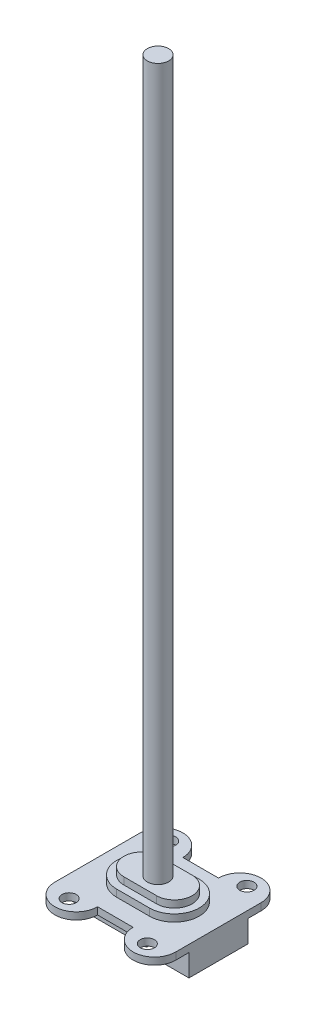
ISO-10303-21;
HEADER;
FILE_DESCRIPTION(('STEP AP214'),'2;1');
FILE_NAME('part.step','',(''),(''),'','','');
FILE_SCHEMA(('AUTOMOTIVE_DESIGN { 1 0 10303 214 1 1 1 1 }'));
ENDSEC;
DATA;
#1=APPLICATION_CONTEXT('core data for automotive mechanical design processes');
#2=APPLICATION_PROTOCOL_DEFINITION('international standard','automotive_design',2000,#1);
#3=PRODUCT_CONTEXT('',#1,'mechanical');
#4=PRODUCT('Part','Part','',(#3));
#5=PRODUCT_RELATED_PRODUCT_CATEGORY('part','',(#4));
#6=PRODUCT_DEFINITION_FORMATION('','',#4);
#7=PRODUCT_DEFINITION_CONTEXT('part definition',#1,'design');
#8=PRODUCT_DEFINITION('design','',#6,#7);
#9=PRODUCT_DEFINITION_SHAPE('','',#8);
#10=(LENGTH_UNIT() NAMED_UNIT(*) SI_UNIT(.MILLI.,.METRE.));
#11=(NAMED_UNIT(*) PLANE_ANGLE_UNIT() SI_UNIT($,.RADIAN.));
#12=(NAMED_UNIT(*) SI_UNIT($,.STERADIAN.) SOLID_ANGLE_UNIT());
#13=UNCERTAINTY_MEASURE_WITH_UNIT(LENGTH_MEASURE(1.E-05),#10,'distance_accuracy_value','');
#14=(GEOMETRIC_REPRESENTATION_CONTEXT(3) GLOBAL_UNCERTAINTY_ASSIGNED_CONTEXT((#13)) GLOBAL_UNIT_ASSIGNED_CONTEXT((#10,
#11,#12)) REPRESENTATION_CONTEXT('',''));
#15=CARTESIAN_POINT('',(0.,0.,0.));
#16=DIRECTION('',(0.,0.,1.));
#17=DIRECTION('',(1.,0.,0.));
#18=AXIS2_PLACEMENT_3D('',#15,#16,#17);
#19=CARTESIAN_POINT('',(0.,0.,0.));
#20=DIRECTION('',(0.,1.,0.));
#21=DIRECTION('',(0.,0.,1.));
#22=AXIS2_PLACEMENT_3D('',#19,#20,#21);
#23=PLANE('',#22);
#24=DIRECTION('',(1.,0.,0.));
#25=VECTOR('',#24,1.);
#26=CARTESIAN_POINT('',(4.3,0.,-4.15));
#27=LINE('',#26,#25);
#28=CARTESIAN_POINT('',(4.3,0.,-4.15));
#29=VERTEX_POINT('',#28);
#30=CARTESIAN_POINT('',(8.5,0.,-4.15));
#31=VERTEX_POINT('',#30);
#32=EDGE_CURVE('E341',#29,#31,#27,.T.);
#33=ORIENTED_EDGE('',*,*,#32,.F.);
#34=DIRECTION('',(0.,0.,1.));
#35=VECTOR('',#34,1.);
#36=CARTESIAN_POINT('',(4.3,0.,9.));
#37=LINE('',#36,#35);
#38=CARTESIAN_POINT('',(4.3,0.,4.15));
#39=VERTEX_POINT('',#38);
#40=EDGE_CURVE('E321',#29,#39,#37,.T.);
#41=ORIENTED_EDGE('',*,*,#40,.T.);
#42=DIRECTION('',(1.,0.,0.));
#43=VECTOR('',#42,1.);
#44=CARTESIAN_POINT('',(4.3,0.,4.15));
#45=LINE('',#44,#43);
#46=CARTESIAN_POINT('',(8.5,0.,4.15));
#47=VERTEX_POINT('',#46);
#48=EDGE_CURVE('E338',#39,#47,#45,.T.);
#49=ORIENTED_EDGE('',*,*,#48,.T.);
#50=DIRECTION('',(0.,0.,-1.));
#51=VECTOR('',#50,1.);
#52=CARTESIAN_POINT('',(8.5,0.,9.));
#53=LINE('',#52,#51);
#54=CARTESIAN_POINT('',(8.5,0.,6.));
#55=VERTEX_POINT('',#54);
#56=EDGE_CURVE('E116',#55,#47,#53,.T.);
#57=ORIENTED_EDGE('',*,*,#56,.F.);
#58=CARTESIAN_POINT('',(5.5,0.,6.));
#59=DIRECTION('',(0.,1.,0.));
#60=DIRECTION('',(0.,0.,-1.));
#61=AXIS2_PLACEMENT_3D('',#58,#59,#60);
#62=CIRCLE('',#61,3.);
#63=CARTESIAN_POINT('',(2.5,0.,6.));
#64=VERTEX_POINT('',#63);
#65=EDGE_CURVE('E430',#64,#55,#62,.T.);
#66=ORIENTED_EDGE('',*,*,#65,.F.);
#67=DIRECTION('',(1.,0.,0.));
#68=VECTOR('',#67,1.);
#69=CARTESIAN_POINT('',(-2.5,0.,6.));
#70=LINE('',#69,#68);
#71=CARTESIAN_POINT('',(-2.5,0.,6.));
#72=VERTEX_POINT('',#71);
#73=EDGE_CURVE('E407',#72,#64,#70,.T.);
#74=ORIENTED_EDGE('',*,*,#73,.F.);
#75=CARTESIAN_POINT('',(-5.5,0.,6.));
#76=DIRECTION('',(0.,-1.,0.));
#77=DIRECTION('',(0.,0.,-1.));
#78=AXIS2_PLACEMENT_3D('',#75,#76,#77);
#79=CIRCLE('',#78,3.);
#80=CARTESIAN_POINT('',(-8.5,0.,6.));
#81=VERTEX_POINT('',#80);
#82=EDGE_CURVE('E440',#72,#81,#79,.T.);
#83=ORIENTED_EDGE('',*,*,#82,.T.);
#84=DIRECTION('',(0.,0.,1.));
#85=VECTOR('',#84,1.);
#86=CARTESIAN_POINT('',(-8.5,0.,9.));
#87=LINE('',#86,#85);
#88=CARTESIAN_POINT('',(-8.5,0.,-6.));
#89=VERTEX_POINT('',#88);
#90=EDGE_CURVE('E478',#89,#81,#87,.T.);
#91=ORIENTED_EDGE('',*,*,#90,.F.);
#92=CARTESIAN_POINT('',(-5.5,0.,-6.));
#93=DIRECTION('',(0.,1.,0.));
#94=DIRECTION('',(0.,0.,1.));
#95=AXIS2_PLACEMENT_3D('',#92,#93,#94);
#96=CIRCLE('',#95,3.);
#97=CARTESIAN_POINT('',(-2.5,0.,-6.));
#98=VERTEX_POINT('',#97);
#99=EDGE_CURVE('E450',#98,#89,#96,.T.);
#100=ORIENTED_EDGE('',*,*,#99,.F.);
#101=DIRECTION('',(1.,0.,0.));
#102=VECTOR('',#101,1.);
#103=CARTESIAN_POINT('',(-2.5,0.,-6.));
#104=LINE('',#103,#102);
#105=CARTESIAN_POINT('',(2.5,0.,-6.));
#106=VERTEX_POINT('',#105);
#107=EDGE_CURVE('E412',#98,#106,#104,.T.);
#108=ORIENTED_EDGE('',*,*,#107,.T.);
#109=CARTESIAN_POINT('',(5.5,0.,-6.));
#110=DIRECTION('',(0.,-1.,0.));
#111=DIRECTION('',(0.,0.,1.));
#112=AXIS2_PLACEMENT_3D('',#109,#110,#111);
#113=CIRCLE('',#112,3.);
#114=CARTESIAN_POINT('',(8.5,0.,-6.));
#115=VERTEX_POINT('',#114);
#116=EDGE_CURVE('E420',#106,#115,#113,.T.);
#117=ORIENTED_EDGE('',*,*,#116,.T.);
#118=EDGE_CURVE('E486',#31,#115,#53,.T.);
#119=ORIENTED_EDGE('',*,*,#118,.F.);
#120=EDGE_LOOP('',(#33,#41,#49,#57,#66,#74,#83,#91,#100,#108,#117,#119));
#121=FACE_BOUND('',#120,.T.);
#122=CARTESIAN_POINT('',(-5.5,0.,-7.));
#123=DIRECTION('',(0.,1.,0.));
#124=DIRECTION('',(0.,0.,1.));
#125=AXIS2_PLACEMENT_3D('',#122,#123,#124);
#126=CIRCLE('',#125,1.);
#127=CARTESIAN_POINT('',(-5.5,0.,-6.));
#128=VERTEX_POINT('',#127);
#129=EDGE_CURVE('E475',#128,#128,#126,.T.);
#130=ORIENTED_EDGE('',*,*,#129,.T.);
#131=EDGE_LOOP('',(#130));
#132=FACE_BOUND('',#131,.T.);
#133=CARTESIAN_POINT('',(5.5,0.,7.));
#134=DIRECTION('',(0.,1.,0.));
#135=DIRECTION('',(0.,0.,1.));
#136=AXIS2_PLACEMENT_3D('',#133,#134,#135);
#137=CIRCLE('',#136,1.);
#138=CARTESIAN_POINT('',(5.5,0.,8.));
#139=VERTEX_POINT('',#138);
#140=EDGE_CURVE('E456',#139,#139,#137,.T.);
#141=ORIENTED_EDGE('',*,*,#140,.T.);
#142=EDGE_LOOP('',(#141));
#143=FACE_BOUND('',#142,.T.);
#144=CARTESIAN_POINT('',(-5.5,0.,7.));
#145=DIRECTION('',(0.,1.,0.));
#146=DIRECTION('',(0.,0.,1.));
#147=AXIS2_PLACEMENT_3D('',#144,#145,#146);
#148=CIRCLE('',#147,1.);
#149=CARTESIAN_POINT('',(-5.5,0.,8.));
#150=VERTEX_POINT('',#149);
#151=EDGE_CURVE('E460',#150,#150,#148,.T.);
#152=ORIENTED_EDGE('',*,*,#151,.T.);
#153=EDGE_LOOP('',(#152));
#154=FACE_BOUND('',#153,.T.);
#155=CARTESIAN_POINT('',(5.5,0.,-7.));
#156=DIRECTION('',(0.,1.,0.));
#157=DIRECTION('',(0.,0.,1.));
#158=AXIS2_PLACEMENT_3D('',#155,#156,#157);
#159=CIRCLE('',#158,1.);
#160=CARTESIAN_POINT('',(5.5,0.,-6.));
#161=VERTEX_POINT('',#160);
#162=EDGE_CURVE('E467',#161,#161,#159,.T.);
#163=ORIENTED_EDGE('',*,*,#162,.T.);
#164=EDGE_LOOP('',(#163));
#165=FACE_BOUND('',#164,.T.);
#166=DIRECTION('',(-1.,0.,0.));
#167=VECTOR('',#166,1.);
#168=CARTESIAN_POINT('',(2.88361673963954,0.,4.5));
#169=LINE('',#168,#167);
#170=CARTESIAN_POINT('',(2.88361673963954,0.,4.5));
#171=VERTEX_POINT('',#170);
#172=CARTESIAN_POINT('',(-7.31638326036046,0.,4.5));
#173=VERTEX_POINT('',#172);
#174=EDGE_CURVE('E291',#171,#173,#169,.T.);
#175=ORIENTED_EDGE('',*,*,#174,.F.);
#176=DIRECTION('',(0.,0.,1.));
#177=VECTOR('',#176,1.);
#178=CARTESIAN_POINT('',(2.88361673963954,0.,-4.5));
#179=LINE('',#178,#177);
#180=CARTESIAN_POINT('',(2.88361673963954,0.,-4.5));
#181=VERTEX_POINT('',#180);
#182=EDGE_CURVE('E286',#181,#171,#179,.T.);
#183=ORIENTED_EDGE('',*,*,#182,.F.);
#184=DIRECTION('',(-1.,0.,0.));
#185=VECTOR('',#184,1.);
#186=CARTESIAN_POINT('',(2.88361673963954,0.,-4.5));
#187=LINE('',#186,#185);
#188=CARTESIAN_POINT('',(-7.31638326036046,0.,-4.5));
#189=VERTEX_POINT('',#188);
#190=EDGE_CURVE('E134',#181,#189,#187,.T.);
#191=ORIENTED_EDGE('',*,*,#190,.T.);
#192=DIRECTION('',(0.,0.,1.));
#193=VECTOR('',#192,1.);
#194=CARTESIAN_POINT('',(-7.31638326036046,0.,-4.5));
#195=LINE('',#194,#193);
#196=EDGE_CURVE('E129',#189,#173,#195,.T.);
#197=ORIENTED_EDGE('',*,*,#196,.T.);
#198=EDGE_LOOP('',(#175,#183,#191,#197));
#199=FACE_BOUND('',#198,.T.);
#200=ADVANCED_FACE('F112',(#121,#132,#143,#154,#165,#199),#23,.F.);
#201=CARTESIAN_POINT('',(0.,2.,0.));
#202=DIRECTION('',(0.,1.,0.));
#203=DIRECTION('',(0.,0.,1.));
#204=AXIS2_PLACEMENT_3D('',#201,#202,#203);
#205=PLANE('',#204);
#206=DIRECTION('',(-1.,0.,0.));
#207=VECTOR('',#206,1.);
#208=CARTESIAN_POINT('',(0.,2.,3.5));
#209=LINE('',#208,#207);
#210=CARTESIAN_POINT('',(2.3,2.,3.5));
#211=VERTEX_POINT('',#210);
#212=CARTESIAN_POINT('',(-2.3,2.,3.5));
#213=VERTEX_POINT('',#212);
#214=EDGE_CURVE('E376',#211,#213,#209,.T.);
#215=ORIENTED_EDGE('',*,*,#214,.F.);
#216=CARTESIAN_POINT('',(2.3,2.,0.));
#217=DIRECTION('',(0.,1.,0.));
#218=DIRECTION('',(0.,0.,1.));
#219=AXIS2_PLACEMENT_3D('',#216,#217,#218);
#220=CIRCLE('',#219,3.5);
#221=CARTESIAN_POINT('',(2.3,2.,-3.5));
#222=VERTEX_POINT('',#221);
#223=EDGE_CURVE('E379',#211,#222,#220,.T.);
#224=ORIENTED_EDGE('',*,*,#223,.T.);
#225=DIRECTION('',(1.,0.,0.));
#226=VECTOR('',#225,1.);
#227=CARTESIAN_POINT('',(0.,2.,-3.5));
#228=LINE('',#227,#226);
#229=CARTESIAN_POINT('',(-2.3,2.,-3.5));
#230=VERTEX_POINT('',#229);
#231=EDGE_CURVE('E382',#230,#222,#228,.T.);
#232=ORIENTED_EDGE('',*,*,#231,.F.);
#233=CARTESIAN_POINT('',(-2.3,2.,0.));
#234=DIRECTION('',(0.,1.,0.));
#235=DIRECTION('',(0.,0.,1.));
#236=AXIS2_PLACEMENT_3D('',#233,#234,#235);
#237=CIRCLE('',#236,3.5);
#238=EDGE_CURVE('E385',#230,#213,#237,.T.);
#239=ORIENTED_EDGE('',*,*,#238,.T.);
#240=EDGE_LOOP('',(#215,#224,#232,#239));
#241=FACE_BOUND('',#240,.T.);
#242=CARTESIAN_POINT('',(2.3,2.,0.));
#243=DIRECTION('',(0.,1.,0.));
#244=DIRECTION('',(0.,0.,1.));
#245=AXIS2_PLACEMENT_3D('',#242,#243,#244);
#246=CIRCLE('',#245,2.5);
#247=CARTESIAN_POINT('',(2.3,2.,2.5));
#248=VERTEX_POINT('',#247);
#249=CARTESIAN_POINT('',(2.3,2.,-2.5));
#250=VERTEX_POINT('',#249);
#251=EDGE_CURVE('E357',#248,#250,#246,.T.);
#252=ORIENTED_EDGE('',*,*,#251,.F.);
#253=DIRECTION('',(-1.,0.,0.));
#254=VECTOR('',#253,1.);
#255=CARTESIAN_POINT('',(0.,2.,2.5));
#256=LINE('',#255,#254);
#257=CARTESIAN_POINT('',(-2.3,2.,2.5));
#258=VERTEX_POINT('',#257);
#259=EDGE_CURVE('E337',#248,#258,#256,.T.);
#260=ORIENTED_EDGE('',*,*,#259,.T.);
#261=CARTESIAN_POINT('',(-2.3,2.,0.));
#262=DIRECTION('',(0.,1.,0.));
#263=DIRECTION('',(0.,0.,1.));
#264=AXIS2_PLACEMENT_3D('',#261,#262,#263);
#265=CIRCLE('',#264,2.5);
#266=CARTESIAN_POINT('',(-2.3,2.,-2.5));
#267=VERTEX_POINT('',#266);
#268=EDGE_CURVE('E348',#267,#258,#265,.T.);
#269=ORIENTED_EDGE('',*,*,#268,.F.);
#270=DIRECTION('',(1.,0.,0.));
#271=VECTOR('',#270,1.);
#272=CARTESIAN_POINT('',(0.,2.,-2.5));
#273=LINE('',#272,#271);
#274=EDGE_CURVE('E360',#267,#250,#273,.T.);
#275=ORIENTED_EDGE('',*,*,#274,.T.);
#276=EDGE_LOOP('',(#252,#260,#269,#275));
#277=FACE_BOUND('',#276,.T.);
#278=ADVANCED_FACE('F551',(#241,#277),#205,.T.);
#279=CARTESIAN_POINT('',(0.,1.,0.));
#280=DIRECTION('',(0.,1.,0.));
#281=DIRECTION('',(0.,0.,1.));
#282=AXIS2_PLACEMENT_3D('',#279,#280,#281);
#283=PLANE('',#282);
#284=CARTESIAN_POINT('',(-5.5,1.,6.));
#285=DIRECTION('',(0.,-1.,0.));
#286=DIRECTION('',(0.,0.,-1.));
#287=AXIS2_PLACEMENT_3D('',#284,#285,#286);
#288=CIRCLE('',#287,3.);
#289=CARTESIAN_POINT('',(-2.5,1.,6.));
#290=VERTEX_POINT('',#289);
#291=CARTESIAN_POINT('',(-8.5,1.,6.));
#292=VERTEX_POINT('',#291);
#293=EDGE_CURVE('E439',#290,#292,#288,.T.);
#294=ORIENTED_EDGE('',*,*,#293,.F.);
#295=DIRECTION('',(1.,0.,0.));
#296=VECTOR('',#295,1.);
#297=CARTESIAN_POINT('',(-2.5,1.,6.));
#298=LINE('',#297,#296);
#299=CARTESIAN_POINT('',(2.5,1.,6.));
#300=VERTEX_POINT('',#299);
#301=EDGE_CURVE('E406',#290,#300,#298,.T.);
#302=ORIENTED_EDGE('',*,*,#301,.T.);
#303=CARTESIAN_POINT('',(5.5,1.,6.));
#304=DIRECTION('',(0.,1.,0.));
#305=DIRECTION('',(0.,0.,-1.));
#306=AXIS2_PLACEMENT_3D('',#303,#304,#305);
#307=CIRCLE('',#306,3.);
#308=CARTESIAN_POINT('',(8.5,1.,6.));
#309=VERTEX_POINT('',#308);
#310=EDGE_CURVE('E429',#300,#309,#307,.T.);
#311=ORIENTED_EDGE('',*,*,#310,.T.);
#312=DIRECTION('',(0.,0.,-1.));
#313=VECTOR('',#312,1.);
#314=CARTESIAN_POINT('',(8.5,1.,9.));
#315=LINE('',#314,#313);
#316=CARTESIAN_POINT('',(8.5,1.,-6.));
#317=VERTEX_POINT('',#316);
#318=EDGE_CURVE('E121',#309,#317,#315,.T.);
#319=ORIENTED_EDGE('',*,*,#318,.T.);
#320=CARTESIAN_POINT('',(5.5,1.,-6.));
#321=DIRECTION('',(0.,-1.,0.));
#322=DIRECTION('',(0.,0.,1.));
#323=AXIS2_PLACEMENT_3D('',#320,#321,#322);
#324=CIRCLE('',#323,3.);
#325=CARTESIAN_POINT('',(2.5,1.,-6.));
#326=VERTEX_POINT('',#325);
#327=EDGE_CURVE('E419',#326,#317,#324,.T.);
#328=ORIENTED_EDGE('',*,*,#327,.F.);
#329=DIRECTION('',(1.,0.,0.));
#330=VECTOR('',#329,1.);
#331=CARTESIAN_POINT('',(-2.5,1.,-6.));
#332=LINE('',#331,#330);
#333=CARTESIAN_POINT('',(-2.5,1.,-6.));
#334=VERTEX_POINT('',#333);
#335=EDGE_CURVE('E409',#334,#326,#332,.T.);
#336=ORIENTED_EDGE('',*,*,#335,.F.);
#337=CARTESIAN_POINT('',(-5.5,1.,-6.));
#338=DIRECTION('',(0.,1.,0.));
#339=DIRECTION('',(0.,0.,1.));
#340=AXIS2_PLACEMENT_3D('',#337,#338,#339);
#341=CIRCLE('',#340,3.);
#342=CARTESIAN_POINT('',(-8.5,1.,-6.));
#343=VERTEX_POINT('',#342);
#344=EDGE_CURVE('E449',#334,#343,#341,.T.);
#345=ORIENTED_EDGE('',*,*,#344,.T.);
#346=DIRECTION('',(0.,0.,1.));
#347=VECTOR('',#346,1.);
#348=CARTESIAN_POINT('',(-8.5,1.,9.));
#349=LINE('',#348,#347);
#350=EDGE_CURVE('E481',#343,#292,#349,.T.);
#351=ORIENTED_EDGE('',*,*,#350,.T.);
#352=EDGE_LOOP('',(#294,#302,#311,#319,#328,#336,#345,#351));
#353=FACE_BOUND('',#352,.T.);
#354=CARTESIAN_POINT('',(-5.5,1.,-7.));
#355=DIRECTION('',(0.,1.,0.));
#356=DIRECTION('',(0.,0.,1.));
#357=AXIS2_PLACEMENT_3D('',#354,#355,#356);
#358=CIRCLE('',#357,1.);
#359=CARTESIAN_POINT('',(-5.5,1.,-6.));
#360=VERTEX_POINT('',#359);
#361=EDGE_CURVE('E466',#360,#360,#358,.T.);
#362=ORIENTED_EDGE('',*,*,#361,.F.);
#363=EDGE_LOOP('',(#362));
#364=FACE_BOUND('',#363,.T.);
#365=CARTESIAN_POINT('',(5.5,1.,7.));
#366=DIRECTION('',(0.,1.,0.));
#367=DIRECTION('',(0.,0.,1.));
#368=AXIS2_PLACEMENT_3D('',#365,#366,#367);
#369=CIRCLE('',#368,1.);
#370=CARTESIAN_POINT('',(5.5,1.,8.));
#371=VERTEX_POINT('',#370);
#372=EDGE_CURVE('E457',#371,#371,#369,.T.);
#373=ORIENTED_EDGE('',*,*,#372,.F.);
#374=EDGE_LOOP('',(#373));
#375=FACE_BOUND('',#374,.T.);
#376=CARTESIAN_POINT('',(-5.5,1.,7.));
#377=DIRECTION('',(0.,1.,0.));
#378=DIRECTION('',(0.,0.,1.));
#379=AXIS2_PLACEMENT_3D('',#376,#377,#378);
#380=CIRCLE('',#379,1.);
#381=CARTESIAN_POINT('',(-5.5,1.,8.));
#382=VERTEX_POINT('',#381);
#383=EDGE_CURVE('E470',#382,#382,#380,.T.);
#384=ORIENTED_EDGE('',*,*,#383,.F.);
#385=EDGE_LOOP('',(#384));
#386=FACE_BOUND('',#385,.T.);
#387=CARTESIAN_POINT('',(5.5,1.,-7.));
#388=DIRECTION('',(0.,1.,0.));
#389=DIRECTION('',(0.,0.,1.));
#390=AXIS2_PLACEMENT_3D('',#387,#388,#389);
#391=CIRCLE('',#390,1.);
#392=CARTESIAN_POINT('',(5.5,1.,-6.));
#393=VERTEX_POINT('',#392);
#394=EDGE_CURVE('E463',#393,#393,#391,.T.);
#395=ORIENTED_EDGE('',*,*,#394,.F.);
#396=EDGE_LOOP('',(#395));
#397=FACE_BOUND('',#396,.T.);
#398=DIRECTION('',(-1.,0.,0.));
#399=VECTOR('',#398,1.);
#400=CARTESIAN_POINT('',(0.,1.,3.5));
#401=LINE('',#400,#399);
#402=CARTESIAN_POINT('',(2.3,1.,3.5));
#403=VERTEX_POINT('',#402);
#404=CARTESIAN_POINT('',(-2.3,1.,3.5));
#405=VERTEX_POINT('',#404);
#406=EDGE_CURVE('E375',#403,#405,#401,.T.);
#407=ORIENTED_EDGE('',*,*,#406,.T.);
#408=CARTESIAN_POINT('',(-2.3,1.,0.));
#409=DIRECTION('',(0.,1.,0.));
#410=DIRECTION('',(0.,0.,1.));
#411=AXIS2_PLACEMENT_3D('',#408,#409,#410);
#412=CIRCLE('',#411,3.5);
#413=CARTESIAN_POINT('',(-2.3,1.,-3.5));
#414=VERTEX_POINT('',#413);
#415=EDGE_CURVE('E380',#414,#405,#412,.T.);
#416=ORIENTED_EDGE('',*,*,#415,.F.);
#417=DIRECTION('',(1.,0.,0.));
#418=VECTOR('',#417,1.);
#419=CARTESIAN_POINT('',(0.,1.,-3.5));
#420=LINE('',#419,#418);
#421=CARTESIAN_POINT('',(2.3,1.,-3.5));
#422=VERTEX_POINT('',#421);
#423=EDGE_CURVE('E393',#414,#422,#420,.T.);
#424=ORIENTED_EDGE('',*,*,#423,.T.);
#425=CARTESIAN_POINT('',(2.3,1.,0.));
#426=DIRECTION('',(0.,1.,0.));
#427=DIRECTION('',(0.,0.,1.));
#428=AXIS2_PLACEMENT_3D('',#425,#426,#427);
#429=CIRCLE('',#428,3.5);
#430=EDGE_CURVE('E390',#403,#422,#429,.T.);
#431=ORIENTED_EDGE('',*,*,#430,.F.);
#432=EDGE_LOOP('',(#407,#416,#424,#431));
#433=FACE_BOUND('',#432,.T.);
#434=ADVANCED_FACE('F523',(#353,#364,#375,#386,#397,#433),#283,.T.);
#435=CARTESIAN_POINT('',(8.5,1.,9.));
#436=DIRECTION('',(-1.,0.,0.));
#437=DIRECTION('',(0.,0.,1.));
#438=AXIS2_PLACEMENT_3D('',#435,#436,#437);
#439=PLANE('',#438);
#440=DIRECTION('',(0.,1.,0.));
#441=VECTOR('',#440,1.);
#442=CARTESIAN_POINT('',(8.5,0.,-6.));
#443=LINE('',#442,#441);
#444=EDGE_CURVE('E423',#115,#317,#443,.T.);
#445=ORIENTED_EDGE('',*,*,#444,.T.);
#446=ORIENTED_EDGE('',*,*,#318,.F.);
#447=DIRECTION('',(0.,1.,0.));
#448=VECTOR('',#447,1.);
#449=CARTESIAN_POINT('',(8.5,0.,6.));
#450=LINE('',#449,#448);
#451=EDGE_CURVE('E432',#55,#309,#450,.T.);
#452=ORIENTED_EDGE('',*,*,#451,.F.);
#453=ORIENTED_EDGE('',*,*,#56,.T.);
#454=DIRECTION('',(0.,-1.,0.));
#455=VECTOR('',#454,1.);
#456=CARTESIAN_POINT('',(8.5,1.,4.15));
#457=LINE('',#456,#455);
#458=CARTESIAN_POINT('',(8.5,-3.1,4.15));
#459=VERTEX_POINT('',#458);
#460=EDGE_CURVE('E318',#47,#459,#457,.T.);
#461=ORIENTED_EDGE('',*,*,#460,.T.);
#462=DIRECTION('',(0.,0.,-1.));
#463=VECTOR('',#462,1.);
#464=CARTESIAN_POINT('',(8.5,-3.1,9.));
#465=LINE('',#464,#463);
#466=CARTESIAN_POINT('',(8.5,-3.1,-4.15));
#467=VERTEX_POINT('',#466);
#468=EDGE_CURVE('E293',#459,#467,#465,.T.);
#469=ORIENTED_EDGE('',*,*,#468,.T.);
#470=DIRECTION('',(0.,1.,0.));
#471=VECTOR('',#470,1.);
#472=CARTESIAN_POINT('',(8.5,1.,-4.15));
#473=LINE('',#472,#471);
#474=EDGE_CURVE('E330',#467,#31,#473,.T.);
#475=ORIENTED_EDGE('',*,*,#474,.T.);
#476=ORIENTED_EDGE('',*,*,#118,.T.);
#477=EDGE_LOOP('',(#445,#446,#452,#453,#461,#469,#475,#476));
#478=FACE_BOUND('',#477,.T.);
#479=ADVANCED_FACE('F496',(#478),#439,.F.);
#480=CARTESIAN_POINT('',(-8.5,1.,9.));
#481=DIRECTION('',(1.,0.,0.));
#482=DIRECTION('',(0.,0.,-1.));
#483=AXIS2_PLACEMENT_3D('',#480,#481,#482);
#484=PLANE('',#483);
#485=DIRECTION('',(0.,1.,0.));
#486=VECTOR('',#485,1.);
#487=CARTESIAN_POINT('',(-8.5,0.,6.));
#488=LINE('',#487,#486);
#489=EDGE_CURVE('E443',#81,#292,#488,.T.);
#490=ORIENTED_EDGE('',*,*,#489,.T.);
#491=ORIENTED_EDGE('',*,*,#350,.F.);
#492=DIRECTION('',(0.,1.,0.));
#493=VECTOR('',#492,1.);
#494=CARTESIAN_POINT('',(-8.5,0.,-6.));
#495=LINE('',#494,#493);
#496=EDGE_CURVE('E452',#89,#343,#495,.T.);
#497=ORIENTED_EDGE('',*,*,#496,.F.);
#498=ORIENTED_EDGE('',*,*,#90,.T.);
#499=EDGE_LOOP('',(#490,#491,#497,#498));
#500=FACE_BOUND('',#499,.T.);
#501=ADVANCED_FACE('F114',(#500),#484,.F.);
#502=CARTESIAN_POINT('',(-5.5,0.,-7.));
#503=DIRECTION('',(0.,1.,0.));
#504=DIRECTION('',(0.,0.,1.));
#505=AXIS2_PLACEMENT_3D('',#502,#503,#504);
#506=CYLINDRICAL_SURFACE('',#505,1.);
#507=ORIENTED_EDGE('',*,*,#129,.F.);
#508=EDGE_LOOP('',(#507));
#509=FACE_BOUND('',#508,.T.);
#510=ORIENTED_EDGE('',*,*,#361,.T.);
#511=EDGE_LOOP('',(#510));
#512=FACE_BOUND('',#511,.T.);
#513=ADVANCED_FACE('F565',(#509,#512),#506,.F.);
#514=CARTESIAN_POINT('',(5.5,0.,7.));
#515=DIRECTION('',(0.,1.,0.));
#516=DIRECTION('',(0.,0.,1.));
#517=AXIS2_PLACEMENT_3D('',#514,#515,#516);
#518=CYLINDRICAL_SURFACE('',#517,1.);
#519=ORIENTED_EDGE('',*,*,#140,.F.);
#520=EDGE_LOOP('',(#519));
#521=FACE_BOUND('',#520,.T.);
#522=ORIENTED_EDGE('',*,*,#372,.T.);
#523=EDGE_LOOP('',(#522));
#524=FACE_BOUND('',#523,.T.);
#525=ADVANCED_FACE('F917',(#521,#524),#518,.F.);
#526=CARTESIAN_POINT('',(-5.5,0.,7.));
#527=DIRECTION('',(0.,1.,0.));
#528=DIRECTION('',(0.,0.,1.));
#529=AXIS2_PLACEMENT_3D('',#526,#527,#528);
#530=CYLINDRICAL_SURFACE('',#529,1.);
#531=ORIENTED_EDGE('',*,*,#151,.F.);
#532=EDGE_LOOP('',(#531));
#533=FACE_BOUND('',#532,.T.);
#534=ORIENTED_EDGE('',*,*,#383,.T.);
#535=EDGE_LOOP('',(#534));
#536=FACE_BOUND('',#535,.T.);
#537=ADVANCED_FACE('F910',(#533,#536),#530,.F.);
#538=CARTESIAN_POINT('',(5.5,0.,-7.));
#539=DIRECTION('',(0.,1.,0.));
#540=DIRECTION('',(0.,0.,1.));
#541=AXIS2_PLACEMENT_3D('',#538,#539,#540);
#542=CYLINDRICAL_SURFACE('',#541,1.);
#543=ORIENTED_EDGE('',*,*,#162,.F.);
#544=EDGE_LOOP('',(#543));
#545=FACE_BOUND('',#544,.T.);
#546=ORIENTED_EDGE('',*,*,#394,.T.);
#547=EDGE_LOOP('',(#546));
#548=FACE_BOUND('',#547,.T.);
#549=ADVANCED_FACE('F897',(#545,#548),#542,.F.);
#550=CARTESIAN_POINT('',(-5.5,0.,-6.));
#551=DIRECTION('',(0.,1.,0.));
#552=DIRECTION('',(0.,0.,1.));
#553=AXIS2_PLACEMENT_3D('',#550,#551,#552);
#554=CYLINDRICAL_SURFACE('',#553,3.);
#555=ORIENTED_EDGE('',*,*,#344,.F.);
#556=DIRECTION('',(0.,1.,0.));
#557=VECTOR('',#556,1.);
#558=CARTESIAN_POINT('',(-2.5,0.,-6.));
#559=LINE('',#558,#557);
#560=EDGE_CURVE('E447',#98,#334,#559,.T.);
#561=ORIENTED_EDGE('',*,*,#560,.F.);
#562=ORIENTED_EDGE('',*,*,#99,.T.);
#563=ORIENTED_EDGE('',*,*,#496,.T.);
#564=EDGE_LOOP('',(#555,#561,#562,#563));
#565=FACE_BOUND('',#564,.T.);
#566=ADVANCED_FACE('F538',(#565),#554,.T.);
#567=CARTESIAN_POINT('',(-5.5,0.,6.));
#568=DIRECTION('',(0.,1.,0.));
#569=DIRECTION('',(0.,0.,1.));
#570=AXIS2_PLACEMENT_3D('',#567,#568,#569);
#571=CYLINDRICAL_SURFACE('',#570,3.);
#572=ORIENTED_EDGE('',*,*,#293,.T.);
#573=ORIENTED_EDGE('',*,*,#489,.F.);
#574=ORIENTED_EDGE('',*,*,#82,.F.);
#575=DIRECTION('',(0.,1.,0.));
#576=VECTOR('',#575,1.);
#577=CARTESIAN_POINT('',(-2.5,0.,6.));
#578=LINE('',#577,#576);
#579=EDGE_CURVE('E436',#72,#290,#578,.T.);
#580=ORIENTED_EDGE('',*,*,#579,.T.);
#581=EDGE_LOOP('',(#572,#573,#574,#580));
#582=FACE_BOUND('',#581,.T.);
#583=ADVANCED_FACE('F533',(#582),#571,.T.);
#584=CARTESIAN_POINT('',(5.5,0.,6.));
#585=DIRECTION('',(0.,1.,0.));
#586=DIRECTION('',(0.,0.,1.));
#587=AXIS2_PLACEMENT_3D('',#584,#585,#586);
#588=CYLINDRICAL_SURFACE('',#587,3.);
#589=ORIENTED_EDGE('',*,*,#310,.F.);
#590=DIRECTION('',(0.,1.,0.));
#591=VECTOR('',#590,1.);
#592=CARTESIAN_POINT('',(2.5,0.,6.));
#593=LINE('',#592,#591);
#594=EDGE_CURVE('E427',#64,#300,#593,.T.);
#595=ORIENTED_EDGE('',*,*,#594,.F.);
#596=ORIENTED_EDGE('',*,*,#65,.T.);
#597=ORIENTED_EDGE('',*,*,#451,.T.);
#598=EDGE_LOOP('',(#589,#595,#596,#597));
#599=FACE_BOUND('',#598,.T.);
#600=ADVANCED_FACE('F528',(#599),#588,.T.);
#601=CARTESIAN_POINT('',(5.5,0.,-6.));
#602=DIRECTION('',(0.,1.,0.));
#603=DIRECTION('',(0.,0.,1.));
#604=AXIS2_PLACEMENT_3D('',#601,#602,#603);
#605=CYLINDRICAL_SURFACE('',#604,3.);
#606=ORIENTED_EDGE('',*,*,#327,.T.);
#607=ORIENTED_EDGE('',*,*,#444,.F.);
#608=ORIENTED_EDGE('',*,*,#116,.F.);
#609=DIRECTION('',(0.,1.,0.));
#610=VECTOR('',#609,1.);
#611=CARTESIAN_POINT('',(2.5,0.,-6.));
#612=LINE('',#611,#610);
#613=EDGE_CURVE('E415',#106,#326,#612,.T.);
#614=ORIENTED_EDGE('',*,*,#613,.T.);
#615=EDGE_LOOP('',(#606,#607,#608,#614));
#616=FACE_BOUND('',#615,.T.);
#617=ADVANCED_FACE('F519',(#616),#605,.T.);
#618=CARTESIAN_POINT('',(-2.5,0.,-6.));
#619=DIRECTION('',(0.,0.,1.));
#620=DIRECTION('',(1.,0.,0.));
#621=AXIS2_PLACEMENT_3D('',#618,#619,#620);
#622=PLANE('',#621);
#623=ORIENTED_EDGE('',*,*,#335,.T.);
#624=ORIENTED_EDGE('',*,*,#613,.F.);
#625=ORIENTED_EDGE('',*,*,#107,.F.);
#626=ORIENTED_EDGE('',*,*,#560,.T.);
#627=EDGE_LOOP('',(#623,#624,#625,#626));
#628=FACE_BOUND('',#627,.T.);
#629=ADVANCED_FACE('F540',(#628),#622,.F.);
#630=CARTESIAN_POINT('',(-2.5,0.,6.));
#631=DIRECTION('',(0.,0.,1.));
#632=DIRECTION('',(1.,0.,0.));
#633=AXIS2_PLACEMENT_3D('',#630,#631,#632);
#634=PLANE('',#633);
#635=ORIENTED_EDGE('',*,*,#301,.F.);
#636=ORIENTED_EDGE('',*,*,#579,.F.);
#637=ORIENTED_EDGE('',*,*,#73,.T.);
#638=ORIENTED_EDGE('',*,*,#594,.T.);
#639=EDGE_LOOP('',(#635,#636,#637,#638));
#640=FACE_BOUND('',#639,.T.);
#641=ADVANCED_FACE('F530',(#640),#634,.T.);
#642=CARTESIAN_POINT('',(0.,2.,3.5));
#643=DIRECTION('',(0.,0.,1.));
#644=DIRECTION('',(1.,0.,0.));
#645=AXIS2_PLACEMENT_3D('',#642,#643,#644);
#646=PLANE('',#645);
#647=ORIENTED_EDGE('',*,*,#406,.F.);
#648=DIRECTION('',(0.,-1.,0.));
#649=VECTOR('',#648,1.);
#650=CARTESIAN_POINT('',(2.3,2.,3.5));
#651=LINE('',#650,#649);
#652=EDGE_CURVE('E404',#211,#403,#651,.T.);
#653=ORIENTED_EDGE('',*,*,#652,.F.);
#654=ORIENTED_EDGE('',*,*,#214,.T.);
#655=DIRECTION('',(0.,-1.,0.));
#656=VECTOR('',#655,1.);
#657=CARTESIAN_POINT('',(-2.3,2.,3.5));
#658=LINE('',#657,#656);
#659=EDGE_CURVE('E387',#213,#405,#658,.T.);
#660=ORIENTED_EDGE('',*,*,#659,.T.);
#661=EDGE_LOOP('',(#647,#653,#654,#660));
#662=FACE_BOUND('',#661,.T.);
#663=ADVANCED_FACE('F547',(#662),#646,.T.);
#664=CARTESIAN_POINT('',(2.3,2.,0.));
#665=DIRECTION('',(0.,-1.,0.));
#666=DIRECTION('',(0.,0.,-1.));
#667=AXIS2_PLACEMENT_3D('',#664,#665,#666);
#668=CYLINDRICAL_SURFACE('',#667,3.5);
#669=ORIENTED_EDGE('',*,*,#430,.T.);
#670=DIRECTION('',(0.,-1.,0.));
#671=VECTOR('',#670,1.);
#672=CARTESIAN_POINT('',(2.3,2.,-3.5));
#673=LINE('',#672,#671);
#674=EDGE_CURVE('E402',#222,#422,#673,.T.);
#675=ORIENTED_EDGE('',*,*,#674,.F.);
#676=ORIENTED_EDGE('',*,*,#223,.F.);
#677=ORIENTED_EDGE('',*,*,#652,.T.);
#678=EDGE_LOOP('',(#669,#675,#676,#677));
#679=FACE_BOUND('',#678,.T.);
#680=ADVANCED_FACE('F772',(#679),#668,.T.);
#681=CARTESIAN_POINT('',(0.,2.,-3.5));
#682=DIRECTION('',(0.,0.,-1.));
#683=DIRECTION('',(-1.,0.,0.));
#684=AXIS2_PLACEMENT_3D('',#681,#682,#683);
#685=PLANE('',#684);
#686=ORIENTED_EDGE('',*,*,#423,.F.);
#687=DIRECTION('',(0.,-1.,0.));
#688=VECTOR('',#687,1.);
#689=CARTESIAN_POINT('',(-2.3,2.,-3.5));
#690=LINE('',#689,#688);
#691=EDGE_CURVE('E399',#230,#414,#690,.T.);
#692=ORIENTED_EDGE('',*,*,#691,.F.);
#693=ORIENTED_EDGE('',*,*,#231,.T.);
#694=ORIENTED_EDGE('',*,*,#674,.T.);
#695=EDGE_LOOP('',(#686,#692,#693,#694));
#696=FACE_BOUND('',#695,.T.);
#697=ADVANCED_FACE('F768',(#696),#685,.T.);
#698=CARTESIAN_POINT('',(-2.3,2.,0.));
#699=DIRECTION('',(0.,-1.,0.));
#700=DIRECTION('',(0.,0.,-1.));
#701=AXIS2_PLACEMENT_3D('',#698,#699,#700);
#702=CYLINDRICAL_SURFACE('',#701,3.5);
#703=ORIENTED_EDGE('',*,*,#415,.T.);
#704=ORIENTED_EDGE('',*,*,#659,.F.);
#705=ORIENTED_EDGE('',*,*,#238,.F.);
#706=ORIENTED_EDGE('',*,*,#691,.T.);
#707=EDGE_LOOP('',(#703,#704,#705,#706));
#708=FACE_BOUND('',#707,.T.);
#709=ADVANCED_FACE('F582',(#708),#702,.T.);
#710=CARTESIAN_POINT('',(0.,3.,2.5));
#711=DIRECTION('',(0.,0.,1.));
#712=DIRECTION('',(1.,0.,0.));
#713=AXIS2_PLACEMENT_3D('',#710,#711,#712);
#714=PLANE('',#713);
#715=ORIENTED_EDGE('',*,*,#259,.F.);
#716=DIRECTION('',(0.,-1.,0.));
#717=VECTOR('',#716,1.);
#718=CARTESIAN_POINT('',(2.3,3.,2.5));
#719=LINE('',#718,#717);
#720=CARTESIAN_POINT('',(2.3,3.,2.5));
#721=VERTEX_POINT('',#720);
#722=EDGE_CURVE('E372',#721,#248,#719,.T.);
#723=ORIENTED_EDGE('',*,*,#722,.F.);
#724=DIRECTION('',(-1.,0.,0.));
#725=VECTOR('',#724,1.);
#726=CARTESIAN_POINT('',(0.,3.,2.5));
#727=LINE('',#726,#725);
#728=CARTESIAN_POINT('',(-2.3,3.,2.5));
#729=VERTEX_POINT('',#728);
#730=EDGE_CURVE('E344',#721,#729,#727,.T.);
#731=ORIENTED_EDGE('',*,*,#730,.T.);
#732=DIRECTION('',(0.,-1.,0.));
#733=VECTOR('',#732,1.);
#734=CARTESIAN_POINT('',(-2.3,3.,2.5));
#735=LINE('',#734,#733);
#736=EDGE_CURVE('E355',#729,#258,#735,.T.);
#737=ORIENTED_EDGE('',*,*,#736,.T.);
#738=EDGE_LOOP('',(#715,#723,#731,#737));
#739=FACE_BOUND('',#738,.T.);
#740=ADVANCED_FACE('F587',(#739),#714,.T.);
#741=CARTESIAN_POINT('',(2.3,3.,0.));
#742=DIRECTION('',(0.,-1.,0.));
#743=DIRECTION('',(0.,0.,-1.));
#744=AXIS2_PLACEMENT_3D('',#741,#742,#743);
#745=CYLINDRICAL_SURFACE('',#744,2.5);
#746=ORIENTED_EDGE('',*,*,#251,.T.);
#747=DIRECTION('',(0.,-1.,0.));
#748=VECTOR('',#747,1.);
#749=CARTESIAN_POINT('',(2.3,3.,-2.5));
#750=LINE('',#749,#748);
#751=CARTESIAN_POINT('',(2.3,3.,-2.5));
#752=VERTEX_POINT('',#751);
#753=EDGE_CURVE('E369',#752,#250,#750,.T.);
#754=ORIENTED_EDGE('',*,*,#753,.F.);
#755=CARTESIAN_POINT('',(2.3,3.,0.));
#756=DIRECTION('',(0.,1.,0.));
#757=DIRECTION('',(0.,0.,1.));
#758=AXIS2_PLACEMENT_3D('',#755,#756,#757);
#759=CIRCLE('',#758,2.5);
#760=EDGE_CURVE('E347',#721,#752,#759,.T.);
#761=ORIENTED_EDGE('',*,*,#760,.F.);
#762=ORIENTED_EDGE('',*,*,#722,.T.);
#763=EDGE_LOOP('',(#746,#754,#761,#762));
#764=FACE_BOUND('',#763,.T.);
#765=ADVANCED_FACE('F592',(#764),#745,.T.);
#766=CARTESIAN_POINT('',(0.,3.,-2.5));
#767=DIRECTION('',(0.,0.,-1.));
#768=DIRECTION('',(-1.,0.,0.));
#769=AXIS2_PLACEMENT_3D('',#766,#767,#768);
#770=PLANE('',#769);
#771=ORIENTED_EDGE('',*,*,#274,.F.);
#772=DIRECTION('',(0.,-1.,0.));
#773=VECTOR('',#772,1.);
#774=CARTESIAN_POINT('',(-2.3,3.,-2.5));
#775=LINE('',#774,#773);
#776=CARTESIAN_POINT('',(-2.3,3.,-2.5));
#777=VERTEX_POINT('',#776);
#778=EDGE_CURVE('E366',#777,#267,#775,.T.);
#779=ORIENTED_EDGE('',*,*,#778,.F.);
#780=DIRECTION('',(1.,0.,0.));
#781=VECTOR('',#780,1.);
#782=CARTESIAN_POINT('',(0.,3.,-2.5));
#783=LINE('',#782,#781);
#784=EDGE_CURVE('E350',#777,#752,#783,.T.);
#785=ORIENTED_EDGE('',*,*,#784,.T.);
#786=ORIENTED_EDGE('',*,*,#753,.T.);
#787=EDGE_LOOP('',(#771,#779,#785,#786));
#788=FACE_BOUND('',#787,.T.);
#789=ADVANCED_FACE('F602',(#788),#770,.T.);
#790=CARTESIAN_POINT('',(-2.3,3.,0.));
#791=DIRECTION('',(0.,-1.,0.));
#792=DIRECTION('',(0.,0.,-1.));
#793=AXIS2_PLACEMENT_3D('',#790,#791,#792);
#794=CYLINDRICAL_SURFACE('',#793,2.5);
#795=ORIENTED_EDGE('',*,*,#268,.T.);
#796=ORIENTED_EDGE('',*,*,#736,.F.);
#797=CARTESIAN_POINT('',(-2.3,3.,0.));
#798=DIRECTION('',(0.,1.,0.));
#799=DIRECTION('',(0.,0.,1.));
#800=AXIS2_PLACEMENT_3D('',#797,#798,#799);
#801=CIRCLE('',#800,2.5);
#802=EDGE_CURVE('E353',#777,#729,#801,.T.);
#803=ORIENTED_EDGE('',*,*,#802,.F.);
#804=ORIENTED_EDGE('',*,*,#778,.T.);
#805=EDGE_LOOP('',(#795,#796,#803,#804));
#806=FACE_BOUND('',#805,.T.);
#807=ADVANCED_FACE('F613',(#806),#794,.T.);
#808=CARTESIAN_POINT('',(0.,3.,0.));
#809=DIRECTION('',(0.,1.,0.));
#810=DIRECTION('',(0.,0.,1.));
#811=AXIS2_PLACEMENT_3D('',#808,#809,#810);
#812=PLANE('',#811);
#813=CARTESIAN_POINT('',(0.,3.,0.));
#814=DIRECTION('',(0.,1.,0.));
#815=DIRECTION('',(0.,0.,1.));
#816=AXIS2_PLACEMENT_3D('',#813,#814,#815);
#817=CIRCLE('',#816,1.5);
#818=CARTESIAN_POINT('',(0.,3.,1.5));
#819=VERTEX_POINT('',#818);
#820=EDGE_CURVE('E12',#819,#819,#817,.T.);
#821=ORIENTED_EDGE('',*,*,#820,.F.);
#822=EDGE_LOOP('',(#821));
#823=FACE_BOUND('',#822,.T.);
#824=ORIENTED_EDGE('',*,*,#730,.F.);
#825=ORIENTED_EDGE('',*,*,#760,.T.);
#826=ORIENTED_EDGE('',*,*,#784,.F.);
#827=ORIENTED_EDGE('',*,*,#802,.T.);
#828=EDGE_LOOP('',(#824,#825,#826,#827));
#829=FACE_BOUND('',#828,.T.);
#830=ADVANCED_FACE('F623',(#823,#829),#812,.T.);
#831=CARTESIAN_POINT('',(4.3,-3.1,9.));
#832=DIRECTION('',(0.,-1.,0.));
#833=DIRECTION('',(0.,0.,-1.));
#834=AXIS2_PLACEMENT_3D('',#831,#832,#833);
#835=PLANE('',#834);
#836=ORIENTED_EDGE('',*,*,#468,.F.);
#837=DIRECTION('',(1.,0.,0.));
#838=VECTOR('',#837,1.);
#839=CARTESIAN_POINT('',(4.3,-3.1,4.15));
#840=LINE('',#839,#838);
#841=CARTESIAN_POINT('',(4.3,-3.1,4.15));
#842=VERTEX_POINT('',#841);
#843=EDGE_CURVE('E335',#842,#459,#840,.T.);
#844=ORIENTED_EDGE('',*,*,#843,.F.);
#845=DIRECTION('',(0.,0.,-1.));
#846=VECTOR('',#845,1.);
#847=CARTESIAN_POINT('',(4.3,-3.1,9.));
#848=LINE('',#847,#846);
#849=CARTESIAN_POINT('',(4.3,-3.1,-4.15));
#850=VERTEX_POINT('',#849);
#851=EDGE_CURVE('E314',#842,#850,#848,.T.);
#852=ORIENTED_EDGE('',*,*,#851,.T.);
#853=DIRECTION('',(1.,0.,0.));
#854=VECTOR('',#853,1.);
#855=CARTESIAN_POINT('',(4.3,-3.1,-4.15));
#856=LINE('',#855,#854);
#857=EDGE_CURVE('E327',#850,#467,#856,.T.);
#858=ORIENTED_EDGE('',*,*,#857,.T.);
#859=EDGE_LOOP('',(#836,#844,#852,#858));
#860=FACE_BOUND('',#859,.T.);
#861=ADVANCED_FACE('F513',(#860),#835,.T.);
#862=CARTESIAN_POINT('',(4.3,1.,4.15));
#863=DIRECTION('',(0.,0.,1.));
#864=DIRECTION('',(1.,0.,0.));
#865=AXIS2_PLACEMENT_3D('',#862,#863,#864);
#866=PLANE('',#865);
#867=ORIENTED_EDGE('',*,*,#460,.F.);
#868=ORIENTED_EDGE('',*,*,#48,.F.);
#869=DIRECTION('',(0.,-1.,0.));
#870=VECTOR('',#869,1.);
#871=CARTESIAN_POINT('',(4.3,1.,4.15));
#872=LINE('',#871,#870);
#873=EDGE_CURVE('E324',#39,#842,#872,.T.);
#874=ORIENTED_EDGE('',*,*,#873,.T.);
#875=ORIENTED_EDGE('',*,*,#843,.T.);
#876=EDGE_LOOP('',(#867,#868,#874,#875));
#877=FACE_BOUND('',#876,.T.);
#878=ADVANCED_FACE('F506',(#877),#866,.T.);
#879=CARTESIAN_POINT('',(4.3,1.,-4.15));
#880=DIRECTION('',(0.,0.,-1.));
#881=DIRECTION('',(-1.,0.,0.));
#882=AXIS2_PLACEMENT_3D('',#879,#880,#881);
#883=PLANE('',#882);
#884=ORIENTED_EDGE('',*,*,#474,.F.);
#885=ORIENTED_EDGE('',*,*,#857,.F.);
#886=DIRECTION('',(0.,1.,0.));
#887=VECTOR('',#886,1.);
#888=CARTESIAN_POINT('',(4.3,1.,-4.15));
#889=LINE('',#888,#887);
#890=EDGE_CURVE('E317',#850,#29,#889,.T.);
#891=ORIENTED_EDGE('',*,*,#890,.T.);
#892=ORIENTED_EDGE('',*,*,#32,.T.);
#893=EDGE_LOOP('',(#884,#885,#891,#892));
#894=FACE_BOUND('',#893,.T.);
#895=ADVANCED_FACE('F652',(#894),#883,.T.);
#896=CARTESIAN_POINT('',(4.3,0.,0.));
#897=DIRECTION('',(1.,0.,0.));
#898=DIRECTION('',(0.,0.,-1.));
#899=AXIS2_PLACEMENT_3D('',#896,#897,#898);
#900=PLANE('',#899);
#901=ORIENTED_EDGE('',*,*,#851,.F.);
#902=ORIENTED_EDGE('',*,*,#873,.F.);
#903=ORIENTED_EDGE('',*,*,#40,.F.);
#904=ORIENTED_EDGE('',*,*,#890,.F.);
#905=EDGE_LOOP('',(#901,#902,#903,#904));
#906=FACE_BOUND('',#905,.T.);
#907=ADVANCED_FACE('F509',(#906),#900,.F.);
#908=CARTESIAN_POINT('',(2.88361673963954,-2.,4.5));
#909=DIRECTION('',(0.,0.,-1.));
#910=DIRECTION('',(-1.,0.,0.));
#911=AXIS2_PLACEMENT_3D('',#908,#909,#910);
#912=PLANE('',#911);
#913=ORIENTED_EDGE('',*,*,#174,.T.);
#914=DIRECTION('',(0.,1.,0.));
#915=VECTOR('',#914,1.);
#916=CARTESIAN_POINT('',(-7.31638326036046,-2.,4.5));
#917=LINE('',#916,#915);
#918=CARTESIAN_POINT('',(-7.31638326036046,-2.,4.5));
#919=VERTEX_POINT('',#918);
#920=EDGE_CURVE('E289',#919,#173,#917,.T.);
#921=ORIENTED_EDGE('',*,*,#920,.F.);
#922=DIRECTION('',(-1.,0.,0.));
#923=VECTOR('',#922,1.);
#924=CARTESIAN_POINT('',(2.88361673963954,-2.,4.5));
#925=LINE('',#924,#923);
#926=CARTESIAN_POINT('',(2.88361673963954,-2.,4.5));
#927=VERTEX_POINT('',#926);
#928=EDGE_CURVE('E274',#927,#919,#925,.T.);
#929=ORIENTED_EDGE('',*,*,#928,.F.);
#930=DIRECTION('',(0.,1.,0.));
#931=VECTOR('',#930,1.);
#932=CARTESIAN_POINT('',(2.88361673963954,-2.,4.5));
#933=LINE('',#932,#931);
#934=EDGE_CURVE('E302',#927,#171,#933,.T.);
#935=ORIENTED_EDGE('',*,*,#934,.T.);
#936=EDGE_LOOP('',(#913,#921,#929,#935));
#937=FACE_BOUND('',#936,.T.);
#938=ADVANCED_FACE('F290',(#937),#912,.F.);
#939=CARTESIAN_POINT('',(-7.31638326036046,-2.,-4.5));
#940=DIRECTION('',(-1.,0.,0.));
#941=DIRECTION('',(0.,0.,1.));
#942=AXIS2_PLACEMENT_3D('',#939,#940,#941);
#943=PLANE('',#942);
#944=ORIENTED_EDGE('',*,*,#196,.F.);
#945=DIRECTION('',(0.,1.,0.));
#946=VECTOR('',#945,1.);
#947=CARTESIAN_POINT('',(-7.31638326036046,-2.,-4.5));
#948=LINE('',#947,#946);
#949=CARTESIAN_POINT('',(-7.31638326036046,-2.,-4.5));
#950=VERTEX_POINT('',#949);
#951=EDGE_CURVE('E294',#950,#189,#948,.T.);
#952=ORIENTED_EDGE('',*,*,#951,.F.);
#953=DIRECTION('',(0.,0.,1.));
#954=VECTOR('',#953,1.);
#955=CARTESIAN_POINT('',(-7.31638326036046,-2.,-4.5));
#956=LINE('',#955,#954);
#957=EDGE_CURVE('E279',#950,#919,#956,.T.);
#958=ORIENTED_EDGE('',*,*,#957,.T.);
#959=ORIENTED_EDGE('',*,*,#920,.T.);
#960=EDGE_LOOP('',(#944,#952,#958,#959));
#961=FACE_BOUND('',#960,.T.);
#962=ADVANCED_FACE('F296',(#961),#943,.T.);
#963=CARTESIAN_POINT('',(2.88361673963954,-2.,-4.5));
#964=DIRECTION('',(0.,0.,-1.));
#965=DIRECTION('',(-1.,0.,0.));
#966=AXIS2_PLACEMENT_3D('',#963,#964,#965);
#967=PLANE('',#966);
#968=ORIENTED_EDGE('',*,*,#190,.F.);
#969=DIRECTION('',(0.,1.,0.));
#970=VECTOR('',#969,1.);
#971=CARTESIAN_POINT('',(2.88361673963954,-2.,-4.5));
#972=LINE('',#971,#970);
#973=CARTESIAN_POINT('',(2.88361673963954,-2.,-4.5));
#974=VERTEX_POINT('',#973);
#975=EDGE_CURVE('E310',#974,#181,#972,.T.);
#976=ORIENTED_EDGE('',*,*,#975,.F.);
#977=DIRECTION('',(-1.,0.,0.));
#978=VECTOR('',#977,1.);
#979=CARTESIAN_POINT('',(2.88361673963954,-2.,-4.5));
#980=LINE('',#979,#978);
#981=EDGE_CURVE('E297',#974,#950,#980,.T.);
#982=ORIENTED_EDGE('',*,*,#981,.T.);
#983=ORIENTED_EDGE('',*,*,#951,.T.);
#984=EDGE_LOOP('',(#968,#976,#982,#983));
#985=FACE_BOUND('',#984,.T.);
#986=ADVANCED_FACE('F693',(#985),#967,.T.);
#987=CARTESIAN_POINT('',(2.88361673963954,-2.,-4.5));
#988=DIRECTION('',(-1.,0.,0.));
#989=DIRECTION('',(0.,0.,1.));
#990=AXIS2_PLACEMENT_3D('',#987,#988,#989);
#991=PLANE('',#990);
#992=ORIENTED_EDGE('',*,*,#182,.T.);
#993=ORIENTED_EDGE('',*,*,#934,.F.);
#994=DIRECTION('',(0.,0.,1.));
#995=VECTOR('',#994,1.);
#996=CARTESIAN_POINT('',(2.88361673963954,-2.,-4.5));
#997=LINE('',#996,#995);
#998=EDGE_CURVE('E282',#974,#927,#997,.T.);
#999=ORIENTED_EDGE('',*,*,#998,.F.);
#1000=ORIENTED_EDGE('',*,*,#975,.T.);
#1001=EDGE_LOOP('',(#992,#993,#999,#1000));
#1002=FACE_BOUND('',#1001,.T.);
#1003=ADVANCED_FACE('F703',(#1002),#991,.F.);
#1004=CARTESIAN_POINT('',(0.,-2.,0.));
#1005=DIRECTION('',(0.,1.,0.));
#1006=DIRECTION('',(0.,0.,1.));
#1007=AXIS2_PLACEMENT_3D('',#1004,#1005,#1006);
#1008=PLANE('',#1007);
#1009=ORIENTED_EDGE('',*,*,#928,.T.);
#1010=ORIENTED_EDGE('',*,*,#957,.F.);
#1011=ORIENTED_EDGE('',*,*,#981,.F.);
#1012=ORIENTED_EDGE('',*,*,#998,.T.);
#1013=EDGE_LOOP('',(#1009,#1010,#1011,#1012));
#1014=FACE_BOUND('',#1013,.T.);
#1015=ADVANCED_FACE('F276',(#1014),#1008,.F.);
#1016=CARTESIAN_POINT('',(0.,103.,0.));
#1017=DIRECTION('',(0.,-1.,0.));
#1018=DIRECTION('',(0.,0.,-1.));
#1019=AXIS2_PLACEMENT_3D('',#1016,#1017,#1018);
#1020=CYLINDRICAL_SURFACE('',#1019,1.5);
#1021=CARTESIAN_POINT('',(0.,103.,0.));
#1022=DIRECTION('',(0.,1.,0.));
#1023=DIRECTION('',(0.,0.,1.));
#1024=AXIS2_PLACEMENT_3D('',#1021,#1022,#1023);
#1025=CIRCLE('',#1024,1.5);
#1026=CARTESIAN_POINT('',(0.,103.,1.5));
#1027=VERTEX_POINT('',#1026);
#1028=EDGE_CURVE('E304',#1027,#1027,#1025,.T.);
#1029=ORIENTED_EDGE('',*,*,#1028,.F.);
#1030=EDGE_LOOP('',(#1029));
#1031=FACE_BOUND('',#1030,.T.);
#1032=ORIENTED_EDGE('',*,*,#820,.T.);
#1033=EDGE_LOOP('',(#1032));
#1034=FACE_BOUND('',#1033,.T.);
#1035=ADVANCED_FACE('F724',(#1031,#1034),#1020,.T.);
#1036=CARTESIAN_POINT('',(0.,103.,0.));
#1037=DIRECTION('',(0.,1.,0.));
#1038=DIRECTION('',(0.,0.,1.));
#1039=AXIS2_PLACEMENT_3D('',#1036,#1037,#1038);
#1040=PLANE('',#1039);
#1041=ORIENTED_EDGE('',*,*,#1028,.T.);
#1042=EDGE_LOOP('',(#1041));
#1043=FACE_BOUND('',#1042,.T.);
#1044=ADVANCED_FACE('F742',(#1043),#1040,.T.);
#1045=CLOSED_SHELL('',(#200,#278,#434,#479,#501,#513,#525,#537,#549,#566,#583,#600,#617,#629,
#641,#663,#680,#697,#709,#740,#765,#789,#807,#830,#861,#878,#895,#907,#938,#962,#986,#1003,
#1015,#1035,#1044));
#1046=MANIFOLD_SOLID_BREP('B2',#1045);
#1047=ADVANCED_BREP_SHAPE_REPRESENTATION('',(#18,#1046),#14);
#1048=SHAPE_DEFINITION_REPRESENTATION(#9,#1047);
ENDSEC;
END-ISO-10303-21;
